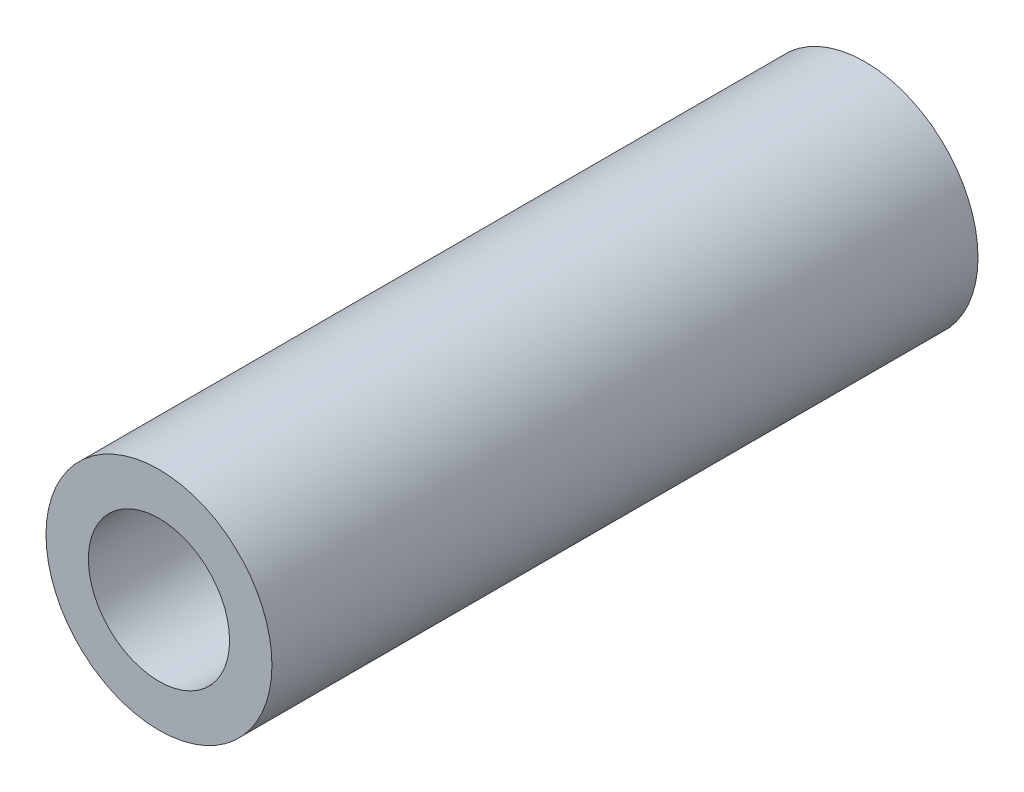
ISO-10303-21;
HEADER;
FILE_DESCRIPTION(('STEP AP214'),'2;1');
FILE_NAME('part.step','',(''),(''),'','','');
FILE_SCHEMA(('AUTOMOTIVE_DESIGN { 1 0 10303 214 1 1 1 1 }'));
ENDSEC;
DATA;
#1=APPLICATION_CONTEXT('core data for automotive mechanical design processes');
#2=APPLICATION_PROTOCOL_DEFINITION('international standard','automotive_design',2000,#1);
#3=PRODUCT_CONTEXT('',#1,'mechanical');
#4=PRODUCT('Part','Part','',(#3));
#5=PRODUCT_RELATED_PRODUCT_CATEGORY('part','',(#4));
#6=PRODUCT_DEFINITION_FORMATION('','',#4);
#7=PRODUCT_DEFINITION_CONTEXT('part definition',#1,'design');
#8=PRODUCT_DEFINITION('design','',#6,#7);
#9=PRODUCT_DEFINITION_SHAPE('','',#8);
#10=(LENGTH_UNIT() NAMED_UNIT(*) SI_UNIT(.MILLI.,.METRE.));
#11=(NAMED_UNIT(*) PLANE_ANGLE_UNIT() SI_UNIT($,.RADIAN.));
#12=(NAMED_UNIT(*) SI_UNIT($,.STERADIAN.) SOLID_ANGLE_UNIT());
#13=UNCERTAINTY_MEASURE_WITH_UNIT(LENGTH_MEASURE(1.E-05),#10,'distance_accuracy_value','');
#14=(GEOMETRIC_REPRESENTATION_CONTEXT(3) GLOBAL_UNCERTAINTY_ASSIGNED_CONTEXT((#13)) GLOBAL_UNIT_ASSIGNED_CONTEXT((#10,
#11,#12)) REPRESENTATION_CONTEXT('',''));
#15=CARTESIAN_POINT('',(0.,0.,0.));
#16=DIRECTION('',(0.,0.,1.));
#17=DIRECTION('',(1.,0.,0.));
#18=AXIS2_PLACEMENT_3D('',#15,#16,#17);
#19=CARTESIAN_POINT('',(0.,0.,12.5));
#20=DIRECTION('',(0.,0.,1.));
#21=DIRECTION('',(1.,0.,0.));
#22=AXIS2_PLACEMENT_3D('',#19,#20,#21);
#23=PLANE('',#22);
#24=CARTESIAN_POINT('',(0.,0.,12.5));
#25=DIRECTION('',(0.,0.,1.));
#26=DIRECTION('',(1.,0.,0.));
#27=AXIS2_PLACEMENT_3D('',#24,#25,#26);
#28=CIRCLE('',#27,4.);
#29=CARTESIAN_POINT('',(4.,0.,12.5));
#30=VERTEX_POINT('',#29);
#31=EDGE_CURVE('E10',#30,#30,#28,.T.);
#32=ORIENTED_EDGE('',*,*,#31,.T.);
#33=EDGE_LOOP('',(#32));
#34=FACE_BOUND('',#33,.T.);
#35=CARTESIAN_POINT('',(0.,0.,12.5));
#36=DIRECTION('',(0.,0.,1.));
#37=DIRECTION('',(1.,0.,0.));
#38=AXIS2_PLACEMENT_3D('',#35,#36,#37);
#39=CIRCLE('',#38,2.5);
#40=CARTESIAN_POINT('',(2.5,0.,12.5));
#41=VERTEX_POINT('',#40);
#42=EDGE_CURVE('E42',#41,#41,#39,.T.);
#43=ORIENTED_EDGE('',*,*,#42,.F.);
#44=EDGE_LOOP('',(#43));
#45=FACE_BOUND('',#44,.T.);
#46=ADVANCED_FACE('F31',(#34,#45),#23,.T.);
#47=CARTESIAN_POINT('',(0.,0.,-12.5));
#48=DIRECTION('',(0.,0.,1.));
#49=DIRECTION('',(1.,0.,0.));
#50=AXIS2_PLACEMENT_3D('',#47,#48,#49);
#51=PLANE('',#50);
#52=CARTESIAN_POINT('',(0.,0.,-12.5));
#53=DIRECTION('',(0.,0.,1.));
#54=DIRECTION('',(1.,0.,0.));
#55=AXIS2_PLACEMENT_3D('',#52,#53,#54);
#56=CIRCLE('',#55,4.);
#57=CARTESIAN_POINT('',(4.,0.,-12.5));
#58=VERTEX_POINT('',#57);
#59=EDGE_CURVE('E35',#58,#58,#56,.T.);
#60=ORIENTED_EDGE('',*,*,#59,.F.);
#61=EDGE_LOOP('',(#60));
#62=FACE_BOUND('',#61,.T.);
#63=CARTESIAN_POINT('',(0.,0.,-12.5));
#64=DIRECTION('',(0.,0.,1.));
#65=DIRECTION('',(1.,0.,0.));
#66=AXIS2_PLACEMENT_3D('',#63,#64,#65);
#67=CIRCLE('',#66,2.5);
#68=CARTESIAN_POINT('',(2.5,0.,-12.5));
#69=VERTEX_POINT('',#68);
#70=EDGE_CURVE('E44',#69,#69,#67,.T.);
#71=ORIENTED_EDGE('',*,*,#70,.T.);
#72=EDGE_LOOP('',(#71));
#73=FACE_BOUND('',#72,.T.);
#74=ADVANCED_FACE('F54',(#62,#73),#51,.F.);
#75=CARTESIAN_POINT('',(0.,0.,12.5));
#76=DIRECTION('',(0.,0.,-1.));
#77=DIRECTION('',(-1.,0.,0.));
#78=AXIS2_PLACEMENT_3D('',#75,#76,#77);
#79=CYLINDRICAL_SURFACE('',#78,4.);
#80=ORIENTED_EDGE('',*,*,#31,.F.);
#81=EDGE_LOOP('',(#80));
#82=FACE_BOUND('',#81,.T.);
#83=ORIENTED_EDGE('',*,*,#59,.T.);
#84=EDGE_LOOP('',(#83));
#85=FACE_BOUND('',#84,.T.);
#86=ADVANCED_FACE('F33',(#82,#85),#79,.T.);
#87=CARTESIAN_POINT('',(0.,0.,12.5));
#88=DIRECTION('',(0.,0.,-1.));
#89=DIRECTION('',(-1.,0.,0.));
#90=AXIS2_PLACEMENT_3D('',#87,#88,#89);
#91=CYLINDRICAL_SURFACE('',#90,2.5);
#92=ORIENTED_EDGE('',*,*,#42,.T.);
#93=EDGE_LOOP('',(#92));
#94=FACE_BOUND('',#93,.T.);
#95=ORIENTED_EDGE('',*,*,#70,.F.);
#96=EDGE_LOOP('',(#95));
#97=FACE_BOUND('',#96,.T.);
#98=ADVANCED_FACE('F50',(#94,#97),#91,.F.);
#99=CLOSED_SHELL('',(#46,#74,#86,#98));
#100=MANIFOLD_SOLID_BREP('B2',#99);
#101=ADVANCED_BREP_SHAPE_REPRESENTATION('',(#18,#100),#14);
#102=SHAPE_DEFINITION_REPRESENTATION(#9,#101);
ENDSEC;
END-ISO-10303-21;
